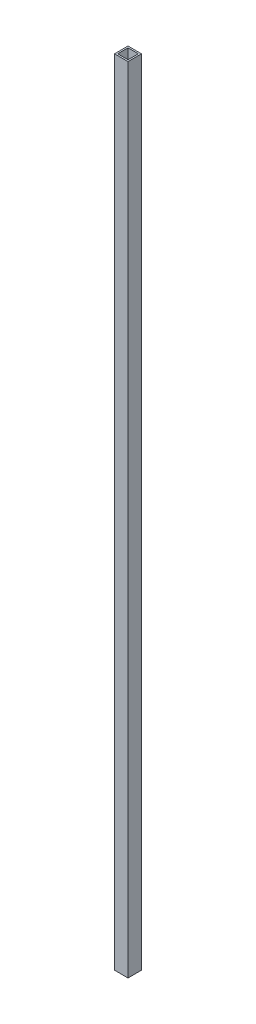
ISO-10303-21;
HEADER;
FILE_DESCRIPTION(('STEP AP214'),'2;1');
FILE_NAME('part.step','',(''),(''),'','','');
FILE_SCHEMA(('AUTOMOTIVE_DESIGN { 1 0 10303 214 1 1 1 1 }'));
ENDSEC;
DATA;
#1=APPLICATION_CONTEXT('core data for automotive mechanical design processes');
#2=APPLICATION_PROTOCOL_DEFINITION('international standard','automotive_design',2000,#1);
#3=PRODUCT_CONTEXT('',#1,'mechanical');
#4=PRODUCT('Part','Part','',(#3));
#5=PRODUCT_RELATED_PRODUCT_CATEGORY('part','',(#4));
#6=PRODUCT_DEFINITION_FORMATION('','',#4);
#7=PRODUCT_DEFINITION_CONTEXT('part definition',#1,'design');
#8=PRODUCT_DEFINITION('design','',#6,#7);
#9=PRODUCT_DEFINITION_SHAPE('','',#8);
#10=(LENGTH_UNIT() NAMED_UNIT(*) SI_UNIT(.MILLI.,.METRE.));
#11=(NAMED_UNIT(*) PLANE_ANGLE_UNIT() SI_UNIT($,.RADIAN.));
#12=(NAMED_UNIT(*) SI_UNIT($,.STERADIAN.) SOLID_ANGLE_UNIT());
#13=UNCERTAINTY_MEASURE_WITH_UNIT(LENGTH_MEASURE(1.E-05),#10,'distance_accuracy_value','');
#14=(GEOMETRIC_REPRESENTATION_CONTEXT(3) GLOBAL_UNCERTAINTY_ASSIGNED_CONTEXT((#13)) GLOBAL_UNIT_ASSIGNED_CONTEXT((#10,
#11,#12)) REPRESENTATION_CONTEXT('',''));
#15=CARTESIAN_POINT('',(0.,0.,0.));
#16=DIRECTION('',(0.,0.,1.));
#17=DIRECTION('',(1.,0.,0.));
#18=AXIS2_PLACEMENT_3D('',#15,#16,#17);
#19=CARTESIAN_POINT('',(0.,500.,0.));
#20=DIRECTION('',(0.,-1.,0.));
#21=DIRECTION('',(0.,0.,-1.));
#22=AXIS2_PLACEMENT_3D('',#19,#20,#21);
#23=PLANE('',#22);
#24=DIRECTION('',(0.,0.,1.));
#25=VECTOR('',#24,1.);
#26=CARTESIAN_POINT('',(15.8767045454545,500.,-21.8352272727272));
#27=LINE('',#26,#25);
#28=CARTESIAN_POINT('',(15.8767045454545,500.,-30.3352272727272));
#29=VERTEX_POINT('',#28);
#30=CARTESIAN_POINT('',(15.8767045454545,500.,-21.8352272727272));
#31=VERTEX_POINT('',#30);
#32=EDGE_CURVE('E152',#29,#31,#27,.T.);
#33=ORIENTED_EDGE('',*,*,#32,.T.);
#34=DIRECTION('',(1.,0.,0.));
#35=VECTOR('',#34,1.);
#36=CARTESIAN_POINT('',(15.8767045454545,500.,-21.8352272727272));
#37=LINE('',#36,#35);
#38=CARTESIAN_POINT('',(24.3767045454545,500.,-21.8352272727272));
#39=VERTEX_POINT('',#38);
#40=EDGE_CURVE('E156',#31,#39,#37,.T.);
#41=ORIENTED_EDGE('',*,*,#40,.T.);
#42=DIRECTION('',(0.,0.,-1.));
#43=VECTOR('',#42,1.);
#44=CARTESIAN_POINT('',(24.3767045454545,500.,-21.8352272727272));
#45=LINE('',#44,#43);
#46=CARTESIAN_POINT('',(24.3767045454545,500.,-30.3352272727272));
#47=VERTEX_POINT('',#46);
#48=EDGE_CURVE('E160',#39,#47,#45,.T.);
#49=ORIENTED_EDGE('',*,*,#48,.T.);
#50=DIRECTION('',(-1.,0.,0.));
#51=VECTOR('',#50,1.);
#52=CARTESIAN_POINT('',(15.8767045454545,500.,-30.3352272727272));
#53=LINE('',#52,#51);
#54=EDGE_CURVE('E163',#47,#29,#53,.T.);
#55=ORIENTED_EDGE('',*,*,#54,.T.);
#56=EDGE_LOOP('',(#33,#41,#49,#55));
#57=FACE_BOUND('',#56,.T.);
#58=DIRECTION('',(0.,0.,1.));
#59=VECTOR('',#58,1.);
#60=CARTESIAN_POINT('',(16.8767045454545,500.,-29.3352272727272));
#61=LINE('',#60,#59);
#62=CARTESIAN_POINT('',(16.8767045454545,500.,-29.3352272727272));
#63=VERTEX_POINT('',#62);
#64=CARTESIAN_POINT('',(16.8767045454545,500.,-22.8352272727272));
#65=VERTEX_POINT('',#64);
#66=EDGE_CURVE('E104',#63,#65,#61,.T.);
#67=ORIENTED_EDGE('',*,*,#66,.F.);
#68=DIRECTION('',(-1.,0.,0.));
#69=VECTOR('',#68,1.);
#70=CARTESIAN_POINT('',(16.8767045454545,500.,-29.3352272727272));
#71=LINE('',#70,#69);
#72=CARTESIAN_POINT('',(23.3767045454545,500.,-29.3352272727272));
#73=VERTEX_POINT('',#72);
#74=EDGE_CURVE('E130',#73,#63,#71,.T.);
#75=ORIENTED_EDGE('',*,*,#74,.F.);
#76=DIRECTION('',(0.,0.,-1.));
#77=VECTOR('',#76,1.);
#78=CARTESIAN_POINT('',(23.3767045454545,500.,-29.3352272727272));
#79=LINE('',#78,#77);
#80=CARTESIAN_POINT('',(23.3767045454545,500.,-22.8352272727272));
#81=VERTEX_POINT('',#80);
#82=EDGE_CURVE('E126',#81,#73,#79,.T.);
#83=ORIENTED_EDGE('',*,*,#82,.F.);
#84=DIRECTION('',(1.,0.,0.));
#85=VECTOR('',#84,1.);
#86=CARTESIAN_POINT('',(16.8767045454545,500.,-22.8352272727272));
#87=LINE('',#86,#85);
#88=EDGE_CURVE('E113',#65,#81,#87,.T.);
#89=ORIENTED_EDGE('',*,*,#88,.F.);
#90=EDGE_LOOP('',(#67,#75,#83,#89));
#91=FACE_BOUND('',#90,.T.);
#92=ADVANCED_FACE('F38',(#57,#91),#23,.F.);
#93=CARTESIAN_POINT('',(0.,0.,0.));
#94=DIRECTION('',(0.,-1.,0.));
#95=DIRECTION('',(0.,0.,-1.));
#96=AXIS2_PLACEMENT_3D('',#93,#94,#95);
#97=PLANE('',#96);
#98=DIRECTION('',(0.,0.,1.));
#99=VECTOR('',#98,1.);
#100=CARTESIAN_POINT('',(15.8767045454545,0.,-21.8352272727272));
#101=LINE('',#100,#99);
#102=CARTESIAN_POINT('',(15.8767045454545,0.,-30.3352272727272));
#103=VERTEX_POINT('',#102);
#104=CARTESIAN_POINT('',(15.8767045454545,0.,-21.8352272727272));
#105=VERTEX_POINT('',#104);
#106=EDGE_CURVE('E122',#103,#105,#101,.T.);
#107=ORIENTED_EDGE('',*,*,#106,.F.);
#108=DIRECTION('',(-1.,0.,0.));
#109=VECTOR('',#108,1.);
#110=CARTESIAN_POINT('',(15.8767045454545,0.,-30.3352272727272));
#111=LINE('',#110,#109);
#112=CARTESIAN_POINT('',(24.3767045454545,0.,-30.3352272727272));
#113=VERTEX_POINT('',#112);
#114=EDGE_CURVE('E157',#113,#103,#111,.T.);
#115=ORIENTED_EDGE('',*,*,#114,.F.);
#116=DIRECTION('',(0.,0.,-1.));
#117=VECTOR('',#116,1.);
#118=CARTESIAN_POINT('',(24.3767045454545,0.,-21.8352272727272));
#119=LINE('',#118,#117);
#120=CARTESIAN_POINT('',(24.3767045454545,0.,-21.8352272727272));
#121=VERTEX_POINT('',#120);
#122=EDGE_CURVE('E173',#121,#113,#119,.T.);
#123=ORIENTED_EDGE('',*,*,#122,.F.);
#124=DIRECTION('',(1.,0.,0.));
#125=VECTOR('',#124,1.);
#126=CARTESIAN_POINT('',(15.8767045454545,0.,-21.8352272727272));
#127=LINE('',#126,#125);
#128=EDGE_CURVE('E170',#105,#121,#127,.T.);
#129=ORIENTED_EDGE('',*,*,#128,.F.);
#130=EDGE_LOOP('',(#107,#115,#123,#129));
#131=FACE_BOUND('',#130,.T.);
#132=DIRECTION('',(-1.,0.,0.));
#133=VECTOR('',#132,1.);
#134=CARTESIAN_POINT('',(16.8767045454545,0.,-29.3352272727272));
#135=LINE('',#134,#133);
#136=CARTESIAN_POINT('',(23.3767045454545,0.,-29.3352272727272));
#137=VERTEX_POINT('',#136);
#138=CARTESIAN_POINT('',(16.8767045454545,0.,-29.3352272727272));
#139=VERTEX_POINT('',#138);
#140=EDGE_CURVE('E114',#137,#139,#135,.T.);
#141=ORIENTED_EDGE('',*,*,#140,.T.);
#142=DIRECTION('',(0.,0.,1.));
#143=VECTOR('',#142,1.);
#144=CARTESIAN_POINT('',(16.8767045454545,0.,-29.3352272727272));
#145=LINE('',#144,#143);
#146=CARTESIAN_POINT('',(16.8767045454545,0.,-22.8352272727272));
#147=VERTEX_POINT('',#146);
#148=EDGE_CURVE('E62',#139,#147,#145,.T.);
#149=ORIENTED_EDGE('',*,*,#148,.T.);
#150=DIRECTION('',(1.,0.,0.));
#151=VECTOR('',#150,1.);
#152=CARTESIAN_POINT('',(16.8767045454545,0.,-22.8352272727272));
#153=LINE('',#152,#151);
#154=CARTESIAN_POINT('',(23.3767045454545,0.,-22.8352272727272));
#155=VERTEX_POINT('',#154);
#156=EDGE_CURVE('E120',#147,#155,#153,.T.);
#157=ORIENTED_EDGE('',*,*,#156,.T.);
#158=DIRECTION('',(0.,0.,-1.));
#159=VECTOR('',#158,1.);
#160=CARTESIAN_POINT('',(23.3767045454545,0.,-29.3352272727272));
#161=LINE('',#160,#159);
#162=EDGE_CURVE('E139',#155,#137,#161,.T.);
#163=ORIENTED_EDGE('',*,*,#162,.T.);
#164=EDGE_LOOP('',(#141,#149,#157,#163));
#165=FACE_BOUND('',#164,.T.);
#166=ADVANCED_FACE('F196',(#131,#165),#97,.T.);
#167=CARTESIAN_POINT('',(15.8767045454545,500.,-21.8352272727272));
#168=DIRECTION('',(1.,0.,0.));
#169=DIRECTION('',(0.,0.,-1.));
#170=AXIS2_PLACEMENT_3D('',#167,#168,#169);
#171=PLANE('',#170);
#172=ORIENTED_EDGE('',*,*,#106,.T.);
#173=DIRECTION('',(0.,-1.,0.));
#174=VECTOR('',#173,1.);
#175=CARTESIAN_POINT('',(15.8767045454545,500.,-21.8352272727272));
#176=LINE('',#175,#174);
#177=EDGE_CURVE('E11',#31,#105,#176,.T.);
#178=ORIENTED_EDGE('',*,*,#177,.F.);
#179=ORIENTED_EDGE('',*,*,#32,.F.);
#180=DIRECTION('',(0.,-1.,0.));
#181=VECTOR('',#180,1.);
#182=CARTESIAN_POINT('',(15.8767045454545,500.,-30.3352272727272));
#183=LINE('',#182,#181);
#184=EDGE_CURVE('E166',#29,#103,#183,.T.);
#185=ORIENTED_EDGE('',*,*,#184,.T.);
#186=EDGE_LOOP('',(#172,#178,#179,#185));
#187=FACE_BOUND('',#186,.T.);
#188=ADVANCED_FACE('F40',(#187),#171,.F.);
#189=CARTESIAN_POINT('',(15.8767045454545,500.,-21.8352272727272));
#190=DIRECTION('',(0.,0.,-1.));
#191=DIRECTION('',(-1.,0.,0.));
#192=AXIS2_PLACEMENT_3D('',#189,#190,#191);
#193=PLANE('',#192);
#194=ORIENTED_EDGE('',*,*,#128,.T.);
#195=DIRECTION('',(0.,-1.,0.));
#196=VECTOR('',#195,1.);
#197=CARTESIAN_POINT('',(24.3767045454545,500.,-21.8352272727272));
#198=LINE('',#197,#196);
#199=EDGE_CURVE('E47',#39,#121,#198,.T.);
#200=ORIENTED_EDGE('',*,*,#199,.F.);
#201=ORIENTED_EDGE('',*,*,#40,.F.);
#202=ORIENTED_EDGE('',*,*,#177,.T.);
#203=EDGE_LOOP('',(#194,#200,#201,#202));
#204=FACE_BOUND('',#203,.T.);
#205=ADVANCED_FACE('F206',(#204),#193,.F.);
#206=CARTESIAN_POINT('',(24.3767045454545,500.,-21.8352272727272));
#207=DIRECTION('',(-1.,0.,0.));
#208=DIRECTION('',(0.,0.,1.));
#209=AXIS2_PLACEMENT_3D('',#206,#207,#208);
#210=PLANE('',#209);
#211=ORIENTED_EDGE('',*,*,#122,.T.);
#212=DIRECTION('',(0.,-1.,0.));
#213=VECTOR('',#212,1.);
#214=CARTESIAN_POINT('',(24.3767045454545,500.,-30.3352272727272));
#215=LINE('',#214,#213);
#216=EDGE_CURVE('E181',#47,#113,#215,.T.);
#217=ORIENTED_EDGE('',*,*,#216,.F.);
#218=ORIENTED_EDGE('',*,*,#48,.F.);
#219=ORIENTED_EDGE('',*,*,#199,.T.);
#220=EDGE_LOOP('',(#211,#217,#218,#219));
#221=FACE_BOUND('',#220,.T.);
#222=ADVANCED_FACE('F190',(#221),#210,.F.);
#223=CARTESIAN_POINT('',(15.8767045454545,500.,-30.3352272727272));
#224=DIRECTION('',(0.,0.,1.));
#225=DIRECTION('',(1.,0.,0.));
#226=AXIS2_PLACEMENT_3D('',#223,#224,#225);
#227=PLANE('',#226);
#228=ORIENTED_EDGE('',*,*,#114,.T.);
#229=ORIENTED_EDGE('',*,*,#184,.F.);
#230=ORIENTED_EDGE('',*,*,#54,.F.);
#231=ORIENTED_EDGE('',*,*,#216,.T.);
#232=EDGE_LOOP('',(#228,#229,#230,#231));
#233=FACE_BOUND('',#232,.T.);
#234=ADVANCED_FACE('F200',(#233),#227,.F.);
#235=CARTESIAN_POINT('',(16.8767045454545,500.,-29.3352272727272));
#236=DIRECTION('',(1.,0.,0.));
#237=DIRECTION('',(0.,0.,-1.));
#238=AXIS2_PLACEMENT_3D('',#235,#236,#237);
#239=PLANE('',#238);
#240=ORIENTED_EDGE('',*,*,#148,.F.);
#241=DIRECTION('',(0.,-1.,0.));
#242=VECTOR('',#241,1.);
#243=CARTESIAN_POINT('',(16.8767045454545,500.,-29.3352272727272));
#244=LINE('',#243,#242);
#245=EDGE_CURVE('E108',#63,#139,#244,.T.);
#246=ORIENTED_EDGE('',*,*,#245,.F.);
#247=ORIENTED_EDGE('',*,*,#66,.T.);
#248=DIRECTION('',(0.,-1.,0.));
#249=VECTOR('',#248,1.);
#250=CARTESIAN_POINT('',(16.8767045454545,500.,-22.8352272727272));
#251=LINE('',#250,#249);
#252=EDGE_CURVE('E107',#65,#147,#251,.T.);
#253=ORIENTED_EDGE('',*,*,#252,.T.);
#254=EDGE_LOOP('',(#240,#246,#247,#253));
#255=FACE_BOUND('',#254,.T.);
#256=ADVANCED_FACE('F106',(#255),#239,.T.);
#257=CARTESIAN_POINT('',(16.8767045454545,500.,-22.8352272727272));
#258=DIRECTION('',(0.,0.,-1.));
#259=DIRECTION('',(-1.,0.,0.));
#260=AXIS2_PLACEMENT_3D('',#257,#258,#259);
#261=PLANE('',#260);
#262=ORIENTED_EDGE('',*,*,#156,.F.);
#263=ORIENTED_EDGE('',*,*,#252,.F.);
#264=ORIENTED_EDGE('',*,*,#88,.T.);
#265=DIRECTION('',(0.,-1.,0.));
#266=VECTOR('',#265,1.);
#267=CARTESIAN_POINT('',(23.3767045454545,500.,-22.8352272727272));
#268=LINE('',#267,#266);
#269=EDGE_CURVE('E123',#81,#155,#268,.T.);
#270=ORIENTED_EDGE('',*,*,#269,.T.);
#271=EDGE_LOOP('',(#262,#263,#264,#270));
#272=FACE_BOUND('',#271,.T.);
#273=ADVANCED_FACE('F117',(#272),#261,.T.);
#274=CARTESIAN_POINT('',(23.3767045454545,500.,-29.3352272727272));
#275=DIRECTION('',(-1.,0.,0.));
#276=DIRECTION('',(0.,0.,1.));
#277=AXIS2_PLACEMENT_3D('',#274,#275,#276);
#278=PLANE('',#277);
#279=ORIENTED_EDGE('',*,*,#162,.F.);
#280=ORIENTED_EDGE('',*,*,#269,.F.);
#281=ORIENTED_EDGE('',*,*,#82,.T.);
#282=DIRECTION('',(0.,-1.,0.));
#283=VECTOR('',#282,1.);
#284=CARTESIAN_POINT('',(23.3767045454545,500.,-29.3352272727272));
#285=LINE('',#284,#283);
#286=EDGE_CURVE('E54',#73,#137,#285,.T.);
#287=ORIENTED_EDGE('',*,*,#286,.T.);
#288=EDGE_LOOP('',(#279,#280,#281,#287));
#289=FACE_BOUND('',#288,.T.);
#290=ADVANCED_FACE('F229',(#289),#278,.T.);
#291=CARTESIAN_POINT('',(16.8767045454545,500.,-29.3352272727272));
#292=DIRECTION('',(0.,0.,1.));
#293=DIRECTION('',(1.,0.,0.));
#294=AXIS2_PLACEMENT_3D('',#291,#292,#293);
#295=PLANE('',#294);
#296=ORIENTED_EDGE('',*,*,#140,.F.);
#297=ORIENTED_EDGE('',*,*,#286,.F.);
#298=ORIENTED_EDGE('',*,*,#74,.T.);
#299=ORIENTED_EDGE('',*,*,#245,.T.);
#300=EDGE_LOOP('',(#296,#297,#298,#299));
#301=FACE_BOUND('',#300,.T.);
#302=ADVANCED_FACE('F233',(#301),#295,.T.);
#303=CLOSED_SHELL('',(#92,#166,#188,#205,#222,#234,#256,#273,#290,#302));
#304=MANIFOLD_SOLID_BREP('B2',#303);
#305=ADVANCED_BREP_SHAPE_REPRESENTATION('',(#18,#304),#14);
#306=SHAPE_DEFINITION_REPRESENTATION(#9,#305);
ENDSEC;
END-ISO-10303-21;
